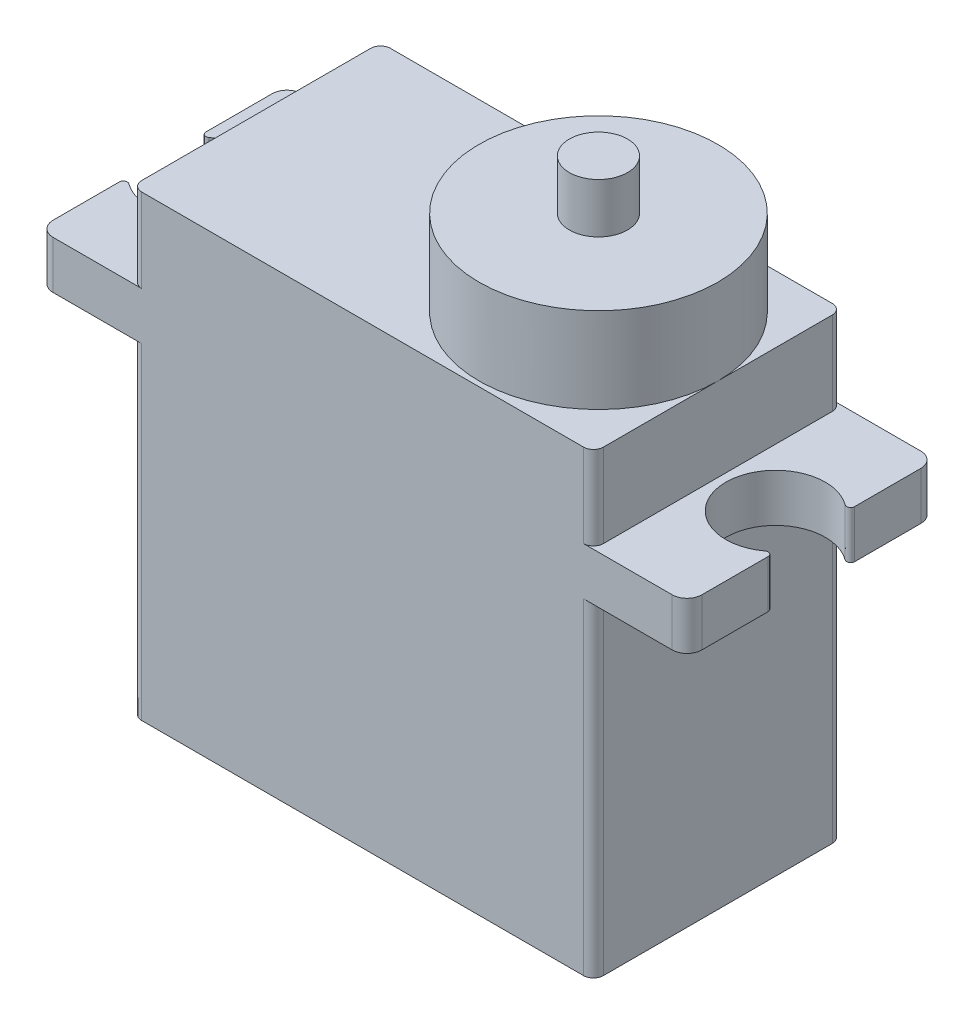
ISO-10303-21;
HEADER;
FILE_DESCRIPTION(('STEP AP214'),'2;1');
FILE_NAME('part.step','',(''),(''),'','','');
FILE_SCHEMA(('AUTOMOTIVE_DESIGN { 1 0 10303 214 1 1 1 1 }'));
ENDSEC;
DATA;
#1=APPLICATION_CONTEXT('core data for automotive mechanical design processes');
#2=APPLICATION_PROTOCOL_DEFINITION('international standard','automotive_design',2000,#1);
#3=PRODUCT_CONTEXT('',#1,'mechanical');
#4=PRODUCT('Part','Part','',(#3));
#5=PRODUCT_RELATED_PRODUCT_CATEGORY('part','',(#4));
#6=PRODUCT_DEFINITION_FORMATION('','',#4);
#7=PRODUCT_DEFINITION_CONTEXT('part definition',#1,'design');
#8=PRODUCT_DEFINITION('design','',#6,#7);
#9=PRODUCT_DEFINITION_SHAPE('','',#8);
#10=(LENGTH_UNIT() NAMED_UNIT(*) SI_UNIT(.MILLI.,.METRE.));
#11=(NAMED_UNIT(*) PLANE_ANGLE_UNIT() SI_UNIT($,.RADIAN.));
#12=(NAMED_UNIT(*) SI_UNIT($,.STERADIAN.) SOLID_ANGLE_UNIT());
#13=UNCERTAINTY_MEASURE_WITH_UNIT(LENGTH_MEASURE(1.E-05),#10,'distance_accuracy_value','');
#14=(GEOMETRIC_REPRESENTATION_CONTEXT(3) GLOBAL_UNCERTAINTY_ASSIGNED_CONTEXT((#13)) GLOBAL_UNIT_ASSIGNED_CONTEXT((#10,
#11,#12)) REPRESENTATION_CONTEXT('',''));
#15=CARTESIAN_POINT('',(0.,0.,0.));
#16=DIRECTION('',(0.,0.,1.));
#17=DIRECTION('',(1.,0.,0.));
#18=AXIS2_PLACEMENT_3D('',#15,#16,#17);
#19=CARTESIAN_POINT('',(16.3,16.4,-6.25));
#20=DIRECTION('',(1.,0.,0.));
#21=DIRECTION('',(0.,0.,-1.));
#22=AXIS2_PLACEMENT_3D('',#19,#20,#21);
#23=PLANE('',#22);
#24=DIRECTION('',(0.,0.,1.));
#25=VECTOR('',#24,1.);
#26=CARTESIAN_POINT('',(16.3,18.8,-6.25));
#27=LINE('',#26,#25);
#28=CARTESIAN_POINT('',(16.3,18.8,-5.5));
#29=VERTEX_POINT('',#28);
#30=CARTESIAN_POINT('',(16.3,18.8,-2.17485631709315));
#31=VERTEX_POINT('',#30);
#32=EDGE_CURVE('E494',#29,#31,#27,.T.);
#33=ORIENTED_EDGE('',*,*,#32,.T.);
#34=DIRECTION('',(0.,-1.,0.));
#35=VECTOR('',#34,1.);
#36=CARTESIAN_POINT('',(16.3,16.4,-2.17485631709315));
#37=LINE('',#36,#35);
#38=CARTESIAN_POINT('',(16.3,16.4,-2.17485631709315));
#39=VERTEX_POINT('',#38);
#40=EDGE_CURVE('E356',#31,#39,#37,.T.);
#41=ORIENTED_EDGE('',*,*,#40,.T.);
#42=DIRECTION('',(0.,0.,1.));
#43=VECTOR('',#42,1.);
#44=CARTESIAN_POINT('',(16.3,16.4,-6.25));
#45=LINE('',#44,#43);
#46=CARTESIAN_POINT('',(16.3,16.4,-5.5));
#47=VERTEX_POINT('',#46);
#48=EDGE_CURVE('E478',#47,#39,#45,.T.);
#49=ORIENTED_EDGE('',*,*,#48,.F.);
#50=DIRECTION('',(0.,1.,0.));
#51=VECTOR('',#50,1.);
#52=CARTESIAN_POINT('',(16.3,18.8,-5.5));
#53=LINE('',#52,#51);
#54=EDGE_CURVE('E298',#47,#29,#53,.T.);
#55=ORIENTED_EDGE('',*,*,#54,.T.);
#56=EDGE_LOOP('',(#33,#41,#49,#55));
#57=FACE_BOUND('',#56,.T.);
#58=ADVANCED_FACE('F37',(#57),#23,.T.);
#59=CARTESIAN_POINT('',(-16.3,16.4,-6.25));
#60=DIRECTION('',(-1.,0.,0.));
#61=DIRECTION('',(0.,0.,1.));
#62=AXIS2_PLACEMENT_3D('',#59,#60,#61);
#63=PLANE('',#62);
#64=DIRECTION('',(0.,0.,1.));
#65=VECTOR('',#64,1.);
#66=CARTESIAN_POINT('',(-16.3,18.8,-6.25));
#67=LINE('',#66,#65);
#68=CARTESIAN_POINT('',(-16.3,18.8,2.17485631709315));
#69=VERTEX_POINT('',#68);
#70=CARTESIAN_POINT('',(-16.3,18.8,5.5));
#71=VERTEX_POINT('',#70);
#72=EDGE_CURVE('E539',#69,#71,#67,.T.);
#73=ORIENTED_EDGE('',*,*,#72,.F.);
#74=DIRECTION('',(0.,-1.,0.));
#75=VECTOR('',#74,1.);
#76=CARTESIAN_POINT('',(-16.3,16.4,2.17485631709315));
#77=LINE('',#76,#75);
#78=CARTESIAN_POINT('',(-16.3,16.4,2.17485631709315));
#79=VERTEX_POINT('',#78);
#80=EDGE_CURVE('E368',#69,#79,#77,.T.);
#81=ORIENTED_EDGE('',*,*,#80,.T.);
#82=DIRECTION('',(0.,0.,1.));
#83=VECTOR('',#82,1.);
#84=CARTESIAN_POINT('',(-16.3,16.4,-6.25));
#85=LINE('',#84,#83);
#86=CARTESIAN_POINT('',(-16.3,16.4,5.5));
#87=VERTEX_POINT('',#86);
#88=EDGE_CURVE('E525',#79,#87,#85,.T.);
#89=ORIENTED_EDGE('',*,*,#88,.T.);
#90=DIRECTION('',(0.,-1.,0.));
#91=VECTOR('',#90,1.);
#92=CARTESIAN_POINT('',(-16.3,18.8,5.5));
#93=LINE('',#92,#91);
#94=EDGE_CURVE('E319',#87,#71,#93,.F.);
#95=ORIENTED_EDGE('',*,*,#94,.T.);
#96=EDGE_LOOP('',(#73,#81,#89,#95));
#97=FACE_BOUND('',#96,.T.);
#98=ADVANCED_FACE('F575',(#97),#63,.T.);
#99=CARTESIAN_POINT('',(-11.6,23.,6.25));
#100=DIRECTION('',(1.,0.,0.));
#101=DIRECTION('',(0.,0.,-1.));
#102=AXIS2_PLACEMENT_3D('',#99,#100,#101);
#103=PLANE('',#102);
#104=DIRECTION('',(0.,0.,1.));
#105=VECTOR('',#104,1.);
#106=CARTESIAN_POINT('',(-11.6,16.4,-6.25));
#107=LINE('',#106,#105);
#108=CARTESIAN_POINT('',(-11.6,16.4,-5.75));
#109=VERTEX_POINT('',#108);
#110=CARTESIAN_POINT('',(-11.6,16.4,5.75));
#111=VERTEX_POINT('',#110);
#112=EDGE_CURVE('E459',#109,#111,#107,.T.);
#113=ORIENTED_EDGE('',*,*,#112,.F.);
#114=DIRECTION('',(0.,-1.,0.));
#115=VECTOR('',#114,1.);
#116=CARTESIAN_POINT('',(-11.6,23.,-5.75));
#117=LINE('',#116,#115);
#118=CARTESIAN_POINT('',(-11.6,0.,-5.75));
#119=VERTEX_POINT('',#118);
#120=EDGE_CURVE('E378',#109,#119,#117,.T.);
#121=ORIENTED_EDGE('',*,*,#120,.T.);
#122=DIRECTION('',(0.,0.,1.));
#123=VECTOR('',#122,1.);
#124=CARTESIAN_POINT('',(-11.6,0.,6.25));
#125=LINE('',#124,#123);
#126=CARTESIAN_POINT('',(-11.6,0.,5.75));
#127=VERTEX_POINT('',#126);
#128=EDGE_CURVE('E273',#119,#127,#125,.T.);
#129=ORIENTED_EDGE('',*,*,#128,.T.);
#130=DIRECTION('',(0.,-1.,0.));
#131=VECTOR('',#130,1.);
#132=CARTESIAN_POINT('',(-11.6,23.,5.75));
#133=LINE('',#132,#131);
#134=EDGE_CURVE('E376',#127,#111,#133,.F.);
#135=ORIENTED_EDGE('',*,*,#134,.T.);
#136=EDGE_LOOP('',(#113,#121,#129,#135));
#137=FACE_BOUND('',#136,.T.);
#138=ADVANCED_FACE('F624',(#137),#103,.F.);
#139=CARTESIAN_POINT('',(11.6,23.,6.25));
#140=DIRECTION('',(-1.,0.,0.));
#141=DIRECTION('',(0.,0.,1.));
#142=AXIS2_PLACEMENT_3D('',#139,#140,#141);
#143=PLANE('',#142);
#144=DIRECTION('',(0.,0.,1.));
#145=VECTOR('',#144,1.);
#146=CARTESIAN_POINT('',(11.6,18.8,-6.25));
#147=LINE('',#146,#145);
#148=CARTESIAN_POINT('',(11.6,18.8,-5.75));
#149=VERTEX_POINT('',#148);
#150=CARTESIAN_POINT('',(11.6,18.8,5.75));
#151=VERTEX_POINT('',#150);
#152=EDGE_CURVE('E291',#149,#151,#147,.T.);
#153=ORIENTED_EDGE('',*,*,#152,.F.);
#154=DIRECTION('',(0.,-1.,0.));
#155=VECTOR('',#154,1.);
#156=CARTESIAN_POINT('',(11.6,23.,-5.75));
#157=LINE('',#156,#155);
#158=CARTESIAN_POINT('',(11.6,23.,-5.75));
#159=VERTEX_POINT('',#158);
#160=EDGE_CURVE('E269',#149,#159,#157,.F.);
#161=ORIENTED_EDGE('',*,*,#160,.T.);
#162=DIRECTION('',(0.,0.,-1.));
#163=VECTOR('',#162,1.);
#164=CARTESIAN_POINT('',(11.6,23.,6.25));
#165=LINE('',#164,#163);
#166=CARTESIAN_POINT('',(11.6,23.,0.));
#167=VERTEX_POINT('',#166);
#168=EDGE_CURVE('E263',#167,#159,#165,.T.);
#169=ORIENTED_EDGE('',*,*,#168,.F.);
#170=CARTESIAN_POINT('',(11.6,23.,5.75));
#171=VERTEX_POINT('',#170);
#172=EDGE_CURVE('E251',#171,#167,#165,.T.);
#173=ORIENTED_EDGE('',*,*,#172,.F.);
#174=DIRECTION('',(0.,-1.,0.));
#175=VECTOR('',#174,1.);
#176=CARTESIAN_POINT('',(11.6,23.,5.75));
#177=LINE('',#176,#175);
#178=EDGE_CURVE('E412',#171,#151,#177,.T.);
#179=ORIENTED_EDGE('',*,*,#178,.T.);
#180=EDGE_LOOP('',(#153,#161,#169,#173,#179));
#181=FACE_BOUND('',#180,.T.);
#182=ADVANCED_FACE('F267',(#181),#143,.F.);
#183=DIRECTION('',(0.,0.,-1.));
#184=VECTOR('',#183,1.);
#185=CARTESIAN_POINT('',(11.6,0.,6.25));
#186=LINE('',#185,#184);
#187=CARTESIAN_POINT('',(11.6,0.,5.75));
#188=VERTEX_POINT('',#187);
#189=CARTESIAN_POINT('',(11.6,0.,-5.75));
#190=VERTEX_POINT('',#189);
#191=EDGE_CURVE('E287',#188,#190,#186,.T.);
#192=ORIENTED_EDGE('',*,*,#191,.T.);
#193=DIRECTION('',(0.,-1.,0.));
#194=VECTOR('',#193,1.);
#195=CARTESIAN_POINT('',(11.6,23.,-5.75));
#196=LINE('',#195,#194);
#197=CARTESIAN_POINT('',(11.6,16.4,-5.75));
#198=VERTEX_POINT('',#197);
#199=EDGE_CURVE('E418',#190,#198,#196,.F.);
#200=ORIENTED_EDGE('',*,*,#199,.T.);
#201=DIRECTION('',(0.,0.,1.));
#202=VECTOR('',#201,1.);
#203=CARTESIAN_POINT('',(11.6,16.4,-6.25));
#204=LINE('',#203,#202);
#205=CARTESIAN_POINT('',(11.6,16.4,5.75));
#206=VERTEX_POINT('',#205);
#207=EDGE_CURVE('E277',#198,#206,#204,.T.);
#208=ORIENTED_EDGE('',*,*,#207,.T.);
#209=DIRECTION('',(0.,-1.,0.));
#210=VECTOR('',#209,1.);
#211=CARTESIAN_POINT('',(11.6,23.,5.75));
#212=LINE('',#211,#210);
#213=EDGE_CURVE('E415',#206,#188,#212,.T.);
#214=ORIENTED_EDGE('',*,*,#213,.T.);
#215=EDGE_LOOP('',(#192,#200,#208,#214));
#216=FACE_BOUND('',#215,.T.);
#217=ADVANCED_FACE('F473',(#216),#143,.F.);
#218=CARTESIAN_POINT('',(-11.6,23.,-6.25));
#219=DIRECTION('',(0.,0.,1.));
#220=DIRECTION('',(1.,0.,0.));
#221=AXIS2_PLACEMENT_3D('',#218,#219,#220);
#222=PLANE('',#221);
#223=DIRECTION('',(-1.,0.,0.));
#224=VECTOR('',#223,1.);
#225=CARTESIAN_POINT('',(-11.6,0.,-6.25));
#226=LINE('',#225,#224);
#227=CARTESIAN_POINT('',(11.1,0.,-6.25));
#228=VERTEX_POINT('',#227);
#229=CARTESIAN_POINT('',(-11.1,0.,-6.25));
#230=VERTEX_POINT('',#229);
#231=EDGE_CURVE('E290',#228,#230,#226,.T.);
#232=ORIENTED_EDGE('',*,*,#231,.T.);
#233=DIRECTION('',(0.,-1.,0.));
#234=VECTOR('',#233,1.);
#235=CARTESIAN_POINT('',(-11.1,23.,-6.25));
#236=LINE('',#235,#234);
#237=CARTESIAN_POINT('',(-11.1,16.4,-6.25));
#238=VERTEX_POINT('',#237);
#239=EDGE_CURVE('E397',#230,#238,#236,.F.);
#240=ORIENTED_EDGE('',*,*,#239,.T.);
#241=DIRECTION('',(1.,0.,0.));
#242=VECTOR('',#241,1.);
#243=CARTESIAN_POINT('',(-11.6,16.4,-6.25));
#244=LINE('',#243,#242);
#245=CARTESIAN_POINT('',(-15.55,16.4,-6.25));
#246=VERTEX_POINT('',#245);
#247=EDGE_CURVE('E535',#246,#238,#244,.T.);
#248=ORIENTED_EDGE('',*,*,#247,.F.);
#249=DIRECTION('',(0.,-1.,0.));
#250=VECTOR('',#249,1.);
#251=CARTESIAN_POINT('',(-15.55,18.8,-6.25));
#252=LINE('',#251,#250);
#253=CARTESIAN_POINT('',(-15.55,18.8,-6.25));
#254=VERTEX_POINT('',#253);
#255=EDGE_CURVE('E306',#246,#254,#252,.F.);
#256=ORIENTED_EDGE('',*,*,#255,.T.);
#257=DIRECTION('',(-1.,0.,0.));
#258=VECTOR('',#257,1.);
#259=CARTESIAN_POINT('',(-11.6,18.8,-6.25));
#260=LINE('',#259,#258);
#261=CARTESIAN_POINT('',(-11.1,18.8,-6.25));
#262=VERTEX_POINT('',#261);
#263=EDGE_CURVE('E544',#262,#254,#260,.T.);
#264=ORIENTED_EDGE('',*,*,#263,.F.);
#265=DIRECTION('',(0.,-1.,0.));
#266=VECTOR('',#265,1.);
#267=CARTESIAN_POINT('',(-11.1,23.,-6.25));
#268=LINE('',#267,#266);
#269=CARTESIAN_POINT('',(-11.1,23.,-6.25));
#270=VERTEX_POINT('',#269);
#271=EDGE_CURVE('E395',#262,#270,#268,.F.);
#272=ORIENTED_EDGE('',*,*,#271,.T.);
#273=DIRECTION('',(-1.,0.,0.));
#274=VECTOR('',#273,1.);
#275=CARTESIAN_POINT('',(-11.6,23.,-6.25));
#276=LINE('',#275,#274);
#277=CARTESIAN_POINT('',(11.1,23.,-6.25));
#278=VERTEX_POINT('',#277);
#279=EDGE_CURVE('E262',#278,#270,#276,.T.);
#280=ORIENTED_EDGE('',*,*,#279,.F.);
#281=DIRECTION('',(0.,-1.,0.));
#282=VECTOR('',#281,1.);
#283=CARTESIAN_POINT('',(11.1,23.,-6.25));
#284=LINE('',#283,#282);
#285=CARTESIAN_POINT('',(11.1,18.8,-6.25));
#286=VERTEX_POINT('',#285);
#287=EDGE_CURVE('E392',#278,#286,#284,.T.);
#288=ORIENTED_EDGE('',*,*,#287,.T.);
#289=DIRECTION('',(-1.,0.,0.));
#290=VECTOR('',#289,1.);
#291=CARTESIAN_POINT('',(11.6,18.8,-6.25));
#292=LINE('',#291,#290);
#293=CARTESIAN_POINT('',(15.55,18.8,-6.25));
#294=VERTEX_POINT('',#293);
#295=EDGE_CURVE('E477',#294,#286,#292,.T.);
#296=ORIENTED_EDGE('',*,*,#295,.F.);
#297=DIRECTION('',(0.,1.,0.));
#298=VECTOR('',#297,1.);
#299=CARTESIAN_POINT('',(15.55,16.4,-6.25));
#300=LINE('',#299,#298);
#301=CARTESIAN_POINT('',(15.55,16.4,-6.25));
#302=VERTEX_POINT('',#301);
#303=EDGE_CURVE('E308',#294,#302,#300,.F.);
#304=ORIENTED_EDGE('',*,*,#303,.T.);
#305=DIRECTION('',(1.,0.,0.));
#306=VECTOR('',#305,1.);
#307=CARTESIAN_POINT('',(11.6,16.4,-6.25));
#308=LINE('',#307,#306);
#309=CARTESIAN_POINT('',(11.1,16.4,-6.25));
#310=VERTEX_POINT('',#309);
#311=EDGE_CURVE('E479',#310,#302,#308,.T.);
#312=ORIENTED_EDGE('',*,*,#311,.F.);
#313=DIRECTION('',(0.,-1.,0.));
#314=VECTOR('',#313,1.);
#315=CARTESIAN_POINT('',(11.1,23.,-6.25));
#316=LINE('',#315,#314);
#317=EDGE_CURVE('E389',#310,#228,#316,.T.);
#318=ORIENTED_EDGE('',*,*,#317,.T.);
#319=EDGE_LOOP('',(#232,#240,#248,#256,#264,#272,#280,#288,#296,#304,#312,#318));
#320=FACE_BOUND('',#319,.T.);
#321=ADVANCED_FACE('F597',(#320),#222,.F.);
#322=DIRECTION('',(0.,0.,1.));
#323=VECTOR('',#322,1.);
#324=CARTESIAN_POINT('',(-11.6,23.,6.25));
#325=LINE('',#324,#323);
#326=CARTESIAN_POINT('',(-11.6,23.,-5.75));
#327=VERTEX_POINT('',#326);
#328=CARTESIAN_POINT('',(-11.6,23.,5.75));
#329=VERTEX_POINT('',#328);
#330=EDGE_CURVE('E281',#327,#329,#325,.T.);
#331=ORIENTED_EDGE('',*,*,#330,.F.);
#332=DIRECTION('',(0.,-1.,0.));
#333=VECTOR('',#332,1.);
#334=CARTESIAN_POINT('',(-11.6,23.,-5.75));
#335=LINE('',#334,#333);
#336=CARTESIAN_POINT('',(-11.6,18.8,-5.75));
#337=VERTEX_POINT('',#336);
#338=EDGE_CURVE('E402',#327,#337,#335,.T.);
#339=ORIENTED_EDGE('',*,*,#338,.T.);
#340=DIRECTION('',(0.,0.,1.));
#341=VECTOR('',#340,1.);
#342=CARTESIAN_POINT('',(-11.6,18.8,-6.25));
#343=LINE('',#342,#341);
#344=CARTESIAN_POINT('',(-11.6,18.8,5.75));
#345=VERTEX_POINT('',#344);
#346=EDGE_CURVE('E532',#337,#345,#343,.T.);
#347=ORIENTED_EDGE('',*,*,#346,.T.);
#348=DIRECTION('',(0.,-1.,0.));
#349=VECTOR('',#348,1.);
#350=CARTESIAN_POINT('',(-11.6,23.,5.75));
#351=LINE('',#350,#349);
#352=EDGE_CURVE('E400',#345,#329,#351,.F.);
#353=ORIENTED_EDGE('',*,*,#352,.T.);
#354=EDGE_LOOP('',(#331,#339,#347,#353));
#355=FACE_BOUND('',#354,.T.);
#356=ADVANCED_FACE('F591',(#355),#103,.F.);
#357=CARTESIAN_POINT('',(-11.6,23.,6.25));
#358=DIRECTION('',(0.,0.,-1.));
#359=DIRECTION('',(-1.,0.,0.));
#360=AXIS2_PLACEMENT_3D('',#357,#358,#359);
#361=PLANE('',#360);
#362=DIRECTION('',(-1.,0.,0.));
#363=VECTOR('',#362,1.);
#364=CARTESIAN_POINT('',(11.6,18.8,6.25));
#365=LINE('',#364,#363);
#366=CARTESIAN_POINT('',(15.55,18.8,6.25));
#367=VERTEX_POINT('',#366);
#368=CARTESIAN_POINT('',(11.1,18.8,6.25));
#369=VERTEX_POINT('',#368);
#370=EDGE_CURVE('E53',#367,#369,#365,.T.);
#371=ORIENTED_EDGE('',*,*,#370,.T.);
#372=DIRECTION('',(0.,-1.,0.));
#373=VECTOR('',#372,1.);
#374=CARTESIAN_POINT('',(11.1,23.,6.25));
#375=LINE('',#374,#373);
#376=CARTESIAN_POINT('',(11.1,23.,6.25));
#377=VERTEX_POINT('',#376);
#378=EDGE_CURVE('E429',#369,#377,#375,.F.);
#379=ORIENTED_EDGE('',*,*,#378,.T.);
#380=DIRECTION('',(1.,0.,0.));
#381=VECTOR('',#380,1.);
#382=CARTESIAN_POINT('',(-11.6,23.,6.25));
#383=LINE('',#382,#381);
#384=CARTESIAN_POINT('',(-11.1,23.,6.25));
#385=VERTEX_POINT('',#384);
#386=EDGE_CURVE('E284',#385,#377,#383,.T.);
#387=ORIENTED_EDGE('',*,*,#386,.F.);
#388=DIRECTION('',(0.,-1.,0.));
#389=VECTOR('',#388,1.);
#390=CARTESIAN_POINT('',(-11.1,23.,6.25));
#391=LINE('',#390,#389);
#392=CARTESIAN_POINT('',(-11.1,18.8,6.25));
#393=VERTEX_POINT('',#392);
#394=EDGE_CURVE('E426',#385,#393,#391,.T.);
#395=ORIENTED_EDGE('',*,*,#394,.T.);
#396=DIRECTION('',(-1.,0.,0.));
#397=VECTOR('',#396,1.);
#398=CARTESIAN_POINT('',(-11.6,18.8,6.25));
#399=LINE('',#398,#397);
#400=CARTESIAN_POINT('',(-15.55,18.8,6.25));
#401=VERTEX_POINT('',#400);
#402=EDGE_CURVE('E61',#393,#401,#399,.T.);
#403=ORIENTED_EDGE('',*,*,#402,.T.);
#404=DIRECTION('',(0.,-1.,0.));
#405=VECTOR('',#404,1.);
#406=CARTESIAN_POINT('',(-15.55,16.4,6.25));
#407=LINE('',#406,#405);
#408=CARTESIAN_POINT('',(-15.55,16.4,6.25));
#409=VERTEX_POINT('',#408);
#410=EDGE_CURVE('E314',#401,#409,#407,.T.);
#411=ORIENTED_EDGE('',*,*,#410,.T.);
#412=DIRECTION('',(1.,0.,0.));
#413=VECTOR('',#412,1.);
#414=CARTESIAN_POINT('',(-11.6,16.4,6.25));
#415=LINE('',#414,#413);
#416=CARTESIAN_POINT('',(-11.1,16.4,6.25));
#417=VERTEX_POINT('',#416);
#418=EDGE_CURVE('E457',#409,#417,#415,.T.);
#419=ORIENTED_EDGE('',*,*,#418,.T.);
#420=DIRECTION('',(0.,-1.,0.));
#421=VECTOR('',#420,1.);
#422=CARTESIAN_POINT('',(-11.1,23.,6.25));
#423=LINE('',#422,#421);
#424=CARTESIAN_POINT('',(-11.1,0.,6.25));
#425=VERTEX_POINT('',#424);
#426=EDGE_CURVE('E420',#417,#425,#423,.T.);
#427=ORIENTED_EDGE('',*,*,#426,.T.);
#428=DIRECTION('',(1.,0.,0.));
#429=VECTOR('',#428,1.);
#430=CARTESIAN_POINT('',(-11.6,0.,6.25));
#431=LINE('',#430,#429);
#432=CARTESIAN_POINT('',(11.1,0.,6.25));
#433=VERTEX_POINT('',#432);
#434=EDGE_CURVE('E271',#425,#433,#431,.T.);
#435=ORIENTED_EDGE('',*,*,#434,.T.);
#436=DIRECTION('',(0.,-1.,0.));
#437=VECTOR('',#436,1.);
#438=CARTESIAN_POINT('',(11.1,23.,6.25));
#439=LINE('',#438,#437);
#440=CARTESIAN_POINT('',(11.1,16.4,6.25));
#441=VERTEX_POINT('',#440);
#442=EDGE_CURVE('E423',#433,#441,#439,.F.);
#443=ORIENTED_EDGE('',*,*,#442,.T.);
#444=DIRECTION('',(1.,0.,0.));
#445=VECTOR('',#444,1.);
#446=CARTESIAN_POINT('',(11.6,16.4,6.25));
#447=LINE('',#446,#445);
#448=CARTESIAN_POINT('',(15.55,16.4,6.25));
#449=VERTEX_POINT('',#448);
#450=EDGE_CURVE('E488',#441,#449,#447,.T.);
#451=ORIENTED_EDGE('',*,*,#450,.T.);
#452=DIRECTION('',(0.,1.,0.));
#453=VECTOR('',#452,1.);
#454=CARTESIAN_POINT('',(15.55,18.8,6.25));
#455=LINE('',#454,#453);
#456=EDGE_CURVE('E317',#449,#367,#455,.T.);
#457=ORIENTED_EDGE('',*,*,#456,.T.);
#458=EDGE_LOOP('',(#371,#379,#387,#395,#403,#411,#419,#427,#435,#443,#451,#457));
#459=FACE_BOUND('',#458,.T.);
#460=ADVANCED_FACE('F463',(#459),#361,.F.);
#461=CARTESIAN_POINT('',(0.,23.,0.));
#462=DIRECTION('',(0.,-1.,0.));
#463=DIRECTION('',(0.,0.,-1.));
#464=AXIS2_PLACEMENT_3D('',#461,#462,#463);
#465=PLANE('',#464);
#466=ORIENTED_EDGE('',*,*,#172,.T.);
#467=CARTESIAN_POINT('',(5.6,23.,0.));
#468=DIRECTION('',(0.,1.,0.));
#469=DIRECTION('',(0.,0.,1.));
#470=AXIS2_PLACEMENT_3D('',#467,#468,#469);
#471=CIRCLE('',#470,6.);
#472=EDGE_CURVE('E255',#167,#167,#471,.T.);
#473=ORIENTED_EDGE('',*,*,#472,.F.);
#474=ORIENTED_EDGE('',*,*,#168,.T.);
#475=CARTESIAN_POINT('',(11.1,23.,-5.75));
#476=DIRECTION('',(0.,-1.,0.));
#477=DIRECTION('',(0.,0.,-1.));
#478=AXIS2_PLACEMENT_3D('',#475,#476,#477);
#479=CIRCLE('',#478,0.5);
#480=EDGE_CURVE('E408',#159,#278,#479,.F.);
#481=ORIENTED_EDGE('',*,*,#480,.T.);
#482=ORIENTED_EDGE('',*,*,#279,.T.);
#483=CARTESIAN_POINT('',(-11.1,23.,-5.75));
#484=DIRECTION('',(0.,-1.,0.));
#485=DIRECTION('',(0.,0.,-1.));
#486=AXIS2_PLACEMENT_3D('',#483,#484,#485);
#487=CIRCLE('',#486,0.5);
#488=EDGE_CURVE('E410',#270,#327,#487,.F.);
#489=ORIENTED_EDGE('',*,*,#488,.T.);
#490=ORIENTED_EDGE('',*,*,#330,.T.);
#491=CARTESIAN_POINT('',(-11.1,23.,5.75));
#492=DIRECTION('',(0.,-1.,0.));
#493=DIRECTION('',(0.,0.,-1.));
#494=AXIS2_PLACEMENT_3D('',#491,#492,#493);
#495=CIRCLE('',#494,0.5);
#496=EDGE_CURVE('E405',#329,#385,#495,.F.);
#497=ORIENTED_EDGE('',*,*,#496,.T.);
#498=ORIENTED_EDGE('',*,*,#386,.T.);
#499=CARTESIAN_POINT('',(11.1,23.,5.75));
#500=DIRECTION('',(0.,-1.,0.));
#501=DIRECTION('',(0.,0.,-1.));
#502=AXIS2_PLACEMENT_3D('',#499,#500,#501);
#503=CIRCLE('',#502,0.5);
#504=EDGE_CURVE('E258',#377,#171,#503,.F.);
#505=ORIENTED_EDGE('',*,*,#504,.T.);
#506=EDGE_LOOP('',(#466,#473,#474,#481,#482,#489,#490,#497,#498,#505));
#507=FACE_BOUND('',#506,.T.);
#508=ADVANCED_FACE('F253',(#507),#465,.F.);
#509=CARTESIAN_POINT('',(0.,0.,0.));
#510=DIRECTION('',(0.,-1.,0.));
#511=DIRECTION('',(0.,0.,-1.));
#512=AXIS2_PLACEMENT_3D('',#509,#510,#511);
#513=PLANE('',#512);
#514=ORIENTED_EDGE('',*,*,#128,.F.);
#515=CARTESIAN_POINT('',(-11.1,0.,-5.75));
#516=DIRECTION('',(0.,-1.,0.));
#517=DIRECTION('',(0.,0.,-1.));
#518=AXIS2_PLACEMENT_3D('',#515,#516,#517);
#519=CIRCLE('',#518,0.5);
#520=EDGE_CURVE('E387',#119,#230,#519,.T.);
#521=ORIENTED_EDGE('',*,*,#520,.T.);
#522=ORIENTED_EDGE('',*,*,#231,.F.);
#523=CARTESIAN_POINT('',(11.1,0.,-5.75));
#524=DIRECTION('',(0.,-1.,0.));
#525=DIRECTION('',(0.,0.,-1.));
#526=AXIS2_PLACEMENT_3D('',#523,#524,#525);
#527=CIRCLE('',#526,0.5);
#528=EDGE_CURVE('E385',#228,#190,#527,.T.);
#529=ORIENTED_EDGE('',*,*,#528,.T.);
#530=ORIENTED_EDGE('',*,*,#191,.F.);
#531=CARTESIAN_POINT('',(11.1,0.,5.75));
#532=DIRECTION('',(0.,-1.,0.));
#533=DIRECTION('',(0.,0.,-1.));
#534=AXIS2_PLACEMENT_3D('',#531,#532,#533);
#535=CIRCLE('',#534,0.5);
#536=EDGE_CURVE('E383',#188,#433,#535,.T.);
#537=ORIENTED_EDGE('',*,*,#536,.T.);
#538=ORIENTED_EDGE('',*,*,#434,.F.);
#539=CARTESIAN_POINT('',(-11.1,0.,5.75));
#540=DIRECTION('',(0.,-1.,0.));
#541=DIRECTION('',(0.,0.,-1.));
#542=AXIS2_PLACEMENT_3D('',#539,#540,#541);
#543=CIRCLE('',#542,0.5);
#544=EDGE_CURVE('E381',#425,#127,#543,.T.);
#545=ORIENTED_EDGE('',*,*,#544,.T.);
#546=EDGE_LOOP('',(#514,#521,#522,#529,#530,#537,#538,#545));
#547=FACE_BOUND('',#546,.T.);
#548=ADVANCED_FACE('F467',(#547),#513,.T.);
#549=CARTESIAN_POINT('',(11.6,18.8,-6.25));
#550=DIRECTION('',(0.,1.,0.));
#551=DIRECTION('',(0.,0.,1.));
#552=AXIS2_PLACEMENT_3D('',#549,#550,#551);
#553=PLANE('',#552);
#554=CARTESIAN_POINT('',(16.3,18.8,2.17485631709315));
#555=VERTEX_POINT('',#554);
#556=CARTESIAN_POINT('',(16.3,18.8,5.5));
#557=VERTEX_POINT('',#556);
#558=EDGE_CURVE('E496',#555,#557,#27,.T.);
#559=ORIENTED_EDGE('',*,*,#558,.F.);
#560=CARTESIAN_POINT('',(16.1,18.8,2.17485631709315));
#561=DIRECTION('',(0.,1.,0.));
#562=DIRECTION('',(0.,0.,1.));
#563=AXIS2_PLACEMENT_3D('',#560,#561,#562);
#564=CIRCLE('',#563,0.2);
#565=CARTESIAN_POINT('',(15.9814814814815,18.8,2.01375584916033));
#566=VERTEX_POINT('',#565);
#567=EDGE_CURVE('E354',#555,#566,#564,.T.);
#568=ORIENTED_EDGE('',*,*,#567,.T.);
#569=CARTESIAN_POINT('',(14.5,18.8,0.));
#570=DIRECTION('',(0.,1.,0.));
#571=DIRECTION('',(0.,0.,1.));
#572=AXIS2_PLACEMENT_3D('',#569,#570,#571);
#573=CIRCLE('',#572,2.5);
#574=CARTESIAN_POINT('',(15.9814814814815,18.8,-2.01375584916033));
#575=VERTEX_POINT('',#574);
#576=EDGE_CURVE('E519',#575,#566,#573,.T.);
#577=ORIENTED_EDGE('',*,*,#576,.F.);
#578=CARTESIAN_POINT('',(16.1,18.8,-2.17485631709315));
#579=DIRECTION('',(0.,1.,0.));
#580=DIRECTION('',(0.,0.,1.));
#581=AXIS2_PLACEMENT_3D('',#578,#579,#580);
#582=CIRCLE('',#581,0.2);
#583=EDGE_CURVE('E352',#575,#31,#582,.T.);
#584=ORIENTED_EDGE('',*,*,#583,.T.);
#585=ORIENTED_EDGE('',*,*,#32,.F.);
#586=CARTESIAN_POINT('',(15.55,18.8,-5.5));
#587=DIRECTION('',(0.,1.,0.));
#588=DIRECTION('',(0.,0.,1.));
#589=AXIS2_PLACEMENT_3D('',#586,#587,#588);
#590=CIRCLE('',#589,0.75);
#591=EDGE_CURVE('E304',#29,#294,#590,.T.);
#592=ORIENTED_EDGE('',*,*,#591,.T.);
#593=ORIENTED_EDGE('',*,*,#295,.T.);
#594=CARTESIAN_POINT('',(11.1,18.8,-5.75));
#595=DIRECTION('',(0.,1.,0.));
#596=DIRECTION('',(0.,0.,1.));
#597=AXIS2_PLACEMENT_3D('',#594,#595,#596);
#598=CIRCLE('',#597,0.5);
#599=EDGE_CURVE('E436',#286,#149,#598,.F.);
#600=ORIENTED_EDGE('',*,*,#599,.T.);
#601=ORIENTED_EDGE('',*,*,#152,.T.);
#602=CARTESIAN_POINT('',(11.1,18.8,5.75));
#603=DIRECTION('',(0.,1.,0.));
#604=DIRECTION('',(0.,0.,1.));
#605=AXIS2_PLACEMENT_3D('',#602,#603,#604);
#606=CIRCLE('',#605,0.5);
#607=EDGE_CURVE('E441',#151,#369,#606,.F.);
#608=ORIENTED_EDGE('',*,*,#607,.T.);
#609=ORIENTED_EDGE('',*,*,#370,.F.);
#610=CARTESIAN_POINT('',(15.55,18.8,5.5));
#611=DIRECTION('',(0.,1.,0.));
#612=DIRECTION('',(0.,0.,1.));
#613=AXIS2_PLACEMENT_3D('',#610,#611,#612);
#614=CIRCLE('',#613,0.75);
#615=EDGE_CURVE('E301',#367,#557,#614,.T.);
#616=ORIENTED_EDGE('',*,*,#615,.T.);
#617=EDGE_LOOP('',(#559,#568,#577,#584,#585,#592,#593,#600,#601,#608,#609,#616));
#618=FACE_BOUND('',#617,.T.);
#619=ADVANCED_FACE('F508',(#618),#553,.T.);
#620=CARTESIAN_POINT('',(16.3,16.4,2.17485631709315));
#621=VERTEX_POINT('',#620);
#622=CARTESIAN_POINT('',(16.3,16.4,5.5));
#623=VERTEX_POINT('',#622);
#624=EDGE_CURVE('E476',#621,#623,#45,.T.);
#625=ORIENTED_EDGE('',*,*,#624,.F.);
#626=DIRECTION('',(0.,-1.,0.));
#627=VECTOR('',#626,1.);
#628=CARTESIAN_POINT('',(16.3,18.8,2.17485631709315));
#629=LINE('',#628,#627);
#630=EDGE_CURVE('E350',#621,#555,#629,.F.);
#631=ORIENTED_EDGE('',*,*,#630,.T.);
#632=ORIENTED_EDGE('',*,*,#558,.T.);
#633=DIRECTION('',(0.,1.,0.));
#634=VECTOR('',#633,1.);
#635=CARTESIAN_POINT('',(16.3,16.4,5.5));
#636=LINE('',#635,#634);
#637=EDGE_CURVE('E286',#557,#623,#636,.F.);
#638=ORIENTED_EDGE('',*,*,#637,.T.);
#639=EDGE_LOOP('',(#625,#631,#632,#638));
#640=FACE_BOUND('',#639,.T.);
#641=ADVANCED_FACE('F503',(#640),#23,.T.);
#642=CARTESIAN_POINT('',(11.6,16.4,-6.25));
#643=DIRECTION('',(0.,-1.,0.));
#644=DIRECTION('',(0.,0.,-1.));
#645=AXIS2_PLACEMENT_3D('',#642,#643,#644);
#646=PLANE('',#645);
#647=CARTESIAN_POINT('',(14.5,16.4,0.));
#648=DIRECTION('',(0.,-1.,0.));
#649=DIRECTION('',(0.,0.,-1.));
#650=AXIS2_PLACEMENT_3D('',#647,#648,#649);
#651=CIRCLE('',#650,2.5);
#652=CARTESIAN_POINT('',(15.9814814814815,16.4,2.01375584916033));
#653=VERTEX_POINT('',#652);
#654=CARTESIAN_POINT('',(15.9814814814815,16.4,-2.01375584916033));
#655=VERTEX_POINT('',#654);
#656=EDGE_CURVE('E337',#653,#655,#651,.T.);
#657=ORIENTED_EDGE('',*,*,#656,.F.);
#658=CARTESIAN_POINT('',(16.1,16.4,2.17485631709315));
#659=DIRECTION('',(0.,-1.,0.));
#660=DIRECTION('',(0.,0.,-1.));
#661=AXIS2_PLACEMENT_3D('',#658,#659,#660);
#662=CIRCLE('',#661,0.2);
#663=EDGE_CURVE('E348',#653,#621,#662,.T.);
#664=ORIENTED_EDGE('',*,*,#663,.T.);
#665=ORIENTED_EDGE('',*,*,#624,.T.);
#666=CARTESIAN_POINT('',(15.55,16.4,5.5));
#667=DIRECTION('',(0.,-1.,0.));
#668=DIRECTION('',(0.,0.,-1.));
#669=AXIS2_PLACEMENT_3D('',#666,#667,#668);
#670=CIRCLE('',#669,0.75);
#671=EDGE_CURVE('E310',#623,#449,#670,.T.);
#672=ORIENTED_EDGE('',*,*,#671,.T.);
#673=ORIENTED_EDGE('',*,*,#450,.F.);
#674=CARTESIAN_POINT('',(11.1,16.4,5.75));
#675=DIRECTION('',(0.,-1.,0.));
#676=DIRECTION('',(0.,0.,-1.));
#677=AXIS2_PLACEMENT_3D('',#674,#675,#676);
#678=CIRCLE('',#677,0.5);
#679=EDGE_CURVE('E444',#441,#206,#678,.F.);
#680=ORIENTED_EDGE('',*,*,#679,.T.);
#681=ORIENTED_EDGE('',*,*,#207,.F.);
#682=CARTESIAN_POINT('',(11.1,16.4,-5.75));
#683=DIRECTION('',(0.,-1.,0.));
#684=DIRECTION('',(0.,0.,-1.));
#685=AXIS2_PLACEMENT_3D('',#682,#683,#684);
#686=CIRCLE('',#685,0.5);
#687=EDGE_CURVE('E438',#198,#310,#686,.F.);
#688=ORIENTED_EDGE('',*,*,#687,.T.);
#689=ORIENTED_EDGE('',*,*,#311,.T.);
#690=CARTESIAN_POINT('',(15.55,16.4,-5.5));
#691=DIRECTION('',(0.,-1.,0.));
#692=DIRECTION('',(0.,0.,-1.));
#693=AXIS2_PLACEMENT_3D('',#690,#691,#692);
#694=CIRCLE('',#693,0.75);
#695=EDGE_CURVE('E312',#302,#47,#694,.T.);
#696=ORIENTED_EDGE('',*,*,#695,.T.);
#697=ORIENTED_EDGE('',*,*,#48,.T.);
#698=CARTESIAN_POINT('',(16.1,16.4,-2.17485631709315));
#699=DIRECTION('',(0.,-1.,0.));
#700=DIRECTION('',(0.,0.,-1.));
#701=AXIS2_PLACEMENT_3D('',#698,#699,#700);
#702=CIRCLE('',#701,0.2);
#703=EDGE_CURVE('E346',#39,#655,#702,.T.);
#704=ORIENTED_EDGE('',*,*,#703,.T.);
#705=EDGE_LOOP('',(#657,#664,#665,#672,#673,#680,#681,#688,#689,#696,#697,#704));
#706=FACE_BOUND('',#705,.T.);
#707=ADVANCED_FACE('F513',(#706),#646,.T.);
#708=CARTESIAN_POINT('',(-11.6,16.4,-6.25));
#709=DIRECTION('',(0.,-1.,0.));
#710=DIRECTION('',(0.,0.,-1.));
#711=AXIS2_PLACEMENT_3D('',#708,#709,#710);
#712=PLANE('',#711);
#713=ORIENTED_EDGE('',*,*,#88,.F.);
#714=CARTESIAN_POINT('',(-16.1,16.4,2.17485631709315));
#715=DIRECTION('',(0.,-1.,0.));
#716=DIRECTION('',(0.,0.,-1.));
#717=AXIS2_PLACEMENT_3D('',#714,#715,#716);
#718=CIRCLE('',#717,0.2);
#719=CARTESIAN_POINT('',(-15.9814814814815,16.4,2.01375584916033));
#720=VERTEX_POINT('',#719);
#721=EDGE_CURVE('E372',#79,#720,#718,.T.);
#722=ORIENTED_EDGE('',*,*,#721,.T.);
#723=CARTESIAN_POINT('',(-14.5,16.4,0.));
#724=DIRECTION('',(0.,-1.,0.));
#725=DIRECTION('',(0.,0.,-1.));
#726=AXIS2_PLACEMENT_3D('',#723,#724,#725);
#727=CIRCLE('',#726,2.5);
#728=CARTESIAN_POINT('',(-15.9814814814815,16.4,-2.01375584916032));
#729=VERTEX_POINT('',#728);
#730=EDGE_CURVE('E523',#729,#720,#727,.T.);
#731=ORIENTED_EDGE('',*,*,#730,.F.);
#732=CARTESIAN_POINT('',(-16.1,16.4,-2.17485631709315));
#733=DIRECTION('',(0.,-1.,0.));
#734=DIRECTION('',(0.,0.,-1.));
#735=AXIS2_PLACEMENT_3D('',#732,#733,#734);
#736=CIRCLE('',#735,0.2);
#737=CARTESIAN_POINT('',(-16.3,16.4,-2.17485631709315));
#738=VERTEX_POINT('',#737);
#739=EDGE_CURVE('E370',#729,#738,#736,.T.);
#740=ORIENTED_EDGE('',*,*,#739,.T.);
#741=CARTESIAN_POINT('',(-16.3,16.4,-5.5));
#742=VERTEX_POINT('',#741);
#743=EDGE_CURVE('E540',#742,#738,#85,.T.);
#744=ORIENTED_EDGE('',*,*,#743,.F.);
#745=CARTESIAN_POINT('',(-15.55,16.4,-5.5));
#746=DIRECTION('',(0.,-1.,0.));
#747=DIRECTION('',(0.,0.,-1.));
#748=AXIS2_PLACEMENT_3D('',#745,#746,#747);
#749=CIRCLE('',#748,0.75);
#750=EDGE_CURVE('E328',#742,#246,#749,.T.);
#751=ORIENTED_EDGE('',*,*,#750,.T.);
#752=ORIENTED_EDGE('',*,*,#247,.T.);
#753=CARTESIAN_POINT('',(-11.1,16.4,-5.75));
#754=DIRECTION('',(0.,-1.,0.));
#755=DIRECTION('',(0.,0.,-1.));
#756=AXIS2_PLACEMENT_3D('',#753,#754,#755);
#757=CIRCLE('',#756,0.5);
#758=EDGE_CURVE('E431',#238,#109,#757,.F.);
#759=ORIENTED_EDGE('',*,*,#758,.T.);
#760=ORIENTED_EDGE('',*,*,#112,.T.);
#761=CARTESIAN_POINT('',(-11.1,16.4,5.75));
#762=DIRECTION('',(0.,-1.,0.));
#763=DIRECTION('',(0.,0.,-1.));
#764=AXIS2_PLACEMENT_3D('',#761,#762,#763);
#765=CIRCLE('',#764,0.5);
#766=EDGE_CURVE('E41',#111,#417,#765,.F.);
#767=ORIENTED_EDGE('',*,*,#766,.T.);
#768=ORIENTED_EDGE('',*,*,#418,.F.);
#769=CARTESIAN_POINT('',(-15.55,16.4,5.5));
#770=DIRECTION('',(0.,-1.,0.));
#771=DIRECTION('',(0.,0.,-1.));
#772=AXIS2_PLACEMENT_3D('',#769,#770,#771);
#773=CIRCLE('',#772,0.75);
#774=EDGE_CURVE('E325',#409,#87,#773,.T.);
#775=ORIENTED_EDGE('',*,*,#774,.T.);
#776=EDGE_LOOP('',(#713,#722,#731,#740,#744,#751,#752,#759,#760,#767,#768,#775));
#777=FACE_BOUND('',#776,.T.);
#778=ADVANCED_FACE('F456',(#777),#712,.T.);
#779=ORIENTED_EDGE('',*,*,#743,.T.);
#780=DIRECTION('',(0.,-1.,0.));
#781=VECTOR('',#780,1.);
#782=CARTESIAN_POINT('',(-16.3,18.8,-2.17485631709315));
#783=LINE('',#782,#781);
#784=CARTESIAN_POINT('',(-16.3,18.8,-2.17485631709315));
#785=VERTEX_POINT('',#784);
#786=EDGE_CURVE('E374',#738,#785,#783,.F.);
#787=ORIENTED_EDGE('',*,*,#786,.T.);
#788=CARTESIAN_POINT('',(-16.3,18.8,-5.5));
#789=VERTEX_POINT('',#788);
#790=EDGE_CURVE('E536',#789,#785,#67,.T.);
#791=ORIENTED_EDGE('',*,*,#790,.F.);
#792=DIRECTION('',(0.,-1.,0.));
#793=VECTOR('',#792,1.);
#794=CARTESIAN_POINT('',(-16.3,16.4,-5.5));
#795=LINE('',#794,#793);
#796=EDGE_CURVE('E322',#789,#742,#795,.T.);
#797=ORIENTED_EDGE('',*,*,#796,.T.);
#798=EDGE_LOOP('',(#779,#787,#791,#797));
#799=FACE_BOUND('',#798,.T.);
#800=ADVANCED_FACE('F560',(#799),#63,.T.);
#801=CARTESIAN_POINT('',(-11.6,18.8,-6.25));
#802=DIRECTION('',(0.,1.,0.));
#803=DIRECTION('',(0.,0.,1.));
#804=AXIS2_PLACEMENT_3D('',#801,#802,#803);
#805=PLANE('',#804);
#806=CARTESIAN_POINT('',(-14.5,18.8,0.));
#807=DIRECTION('',(0.,1.,0.));
#808=DIRECTION('',(0.,0.,1.));
#809=AXIS2_PLACEMENT_3D('',#806,#807,#808);
#810=CIRCLE('',#809,2.5);
#811=CARTESIAN_POINT('',(-15.9814814814815,18.8,2.01375584916033));
#812=VERTEX_POINT('',#811);
#813=CARTESIAN_POINT('',(-15.9814814814815,18.8,-2.01375584916032));
#814=VERTEX_POINT('',#813);
#815=EDGE_CURVE('E334',#812,#814,#810,.T.);
#816=ORIENTED_EDGE('',*,*,#815,.F.);
#817=CARTESIAN_POINT('',(-16.1,18.8,2.17485631709315));
#818=DIRECTION('',(0.,1.,0.));
#819=DIRECTION('',(0.,0.,1.));
#820=AXIS2_PLACEMENT_3D('',#817,#818,#819);
#821=CIRCLE('',#820,0.2);
#822=EDGE_CURVE('E366',#812,#69,#821,.T.);
#823=ORIENTED_EDGE('',*,*,#822,.T.);
#824=ORIENTED_EDGE('',*,*,#72,.T.);
#825=CARTESIAN_POINT('',(-15.55,18.8,5.5));
#826=DIRECTION('',(0.,1.,0.));
#827=DIRECTION('',(0.,0.,1.));
#828=AXIS2_PLACEMENT_3D('',#825,#826,#827);
#829=CIRCLE('',#828,0.75);
#830=EDGE_CURVE('E330',#71,#401,#829,.T.);
#831=ORIENTED_EDGE('',*,*,#830,.T.);
#832=ORIENTED_EDGE('',*,*,#402,.F.);
#833=CARTESIAN_POINT('',(-11.1,18.8,5.75));
#834=DIRECTION('',(0.,1.,0.));
#835=DIRECTION('',(0.,0.,1.));
#836=AXIS2_PLACEMENT_3D('',#833,#834,#835);
#837=CIRCLE('',#836,0.5);
#838=EDGE_CURVE('E443',#393,#345,#837,.F.);
#839=ORIENTED_EDGE('',*,*,#838,.T.);
#840=ORIENTED_EDGE('',*,*,#346,.F.);
#841=CARTESIAN_POINT('',(-11.1,18.8,-5.75));
#842=DIRECTION('',(0.,1.,0.));
#843=DIRECTION('',(0.,0.,1.));
#844=AXIS2_PLACEMENT_3D('',#841,#842,#843);
#845=CIRCLE('',#844,0.5);
#846=EDGE_CURVE('E433',#337,#262,#845,.F.);
#847=ORIENTED_EDGE('',*,*,#846,.T.);
#848=ORIENTED_EDGE('',*,*,#263,.T.);
#849=CARTESIAN_POINT('',(-15.55,18.8,-5.5));
#850=DIRECTION('',(0.,1.,0.));
#851=DIRECTION('',(0.,0.,1.));
#852=AXIS2_PLACEMENT_3D('',#849,#850,#851);
#853=CIRCLE('',#852,0.75);
#854=EDGE_CURVE('E332',#254,#789,#853,.T.);
#855=ORIENTED_EDGE('',*,*,#854,.T.);
#856=ORIENTED_EDGE('',*,*,#790,.T.);
#857=CARTESIAN_POINT('',(-16.1,18.8,-2.17485631709315));
#858=DIRECTION('',(0.,1.,0.));
#859=DIRECTION('',(0.,0.,1.));
#860=AXIS2_PLACEMENT_3D('',#857,#858,#859);
#861=CIRCLE('',#860,0.2);
#862=EDGE_CURVE('E364',#785,#814,#861,.T.);
#863=ORIENTED_EDGE('',*,*,#862,.T.);
#864=EDGE_LOOP('',(#816,#823,#824,#831,#832,#839,#840,#847,#848,#855,#856,#863));
#865=FACE_BOUND('',#864,.T.);
#866=ADVANCED_FACE('F549',(#865),#805,.T.);
#867=CARTESIAN_POINT('',(15.55,16.4,-5.5));
#868=DIRECTION('',(0.,-1.,0.));
#869=DIRECTION('',(0.,0.,-1.));
#870=AXIS2_PLACEMENT_3D('',#867,#868,#869);
#871=CYLINDRICAL_SURFACE('',#870,0.75);
#872=ORIENTED_EDGE('',*,*,#695,.F.);
#873=ORIENTED_EDGE('',*,*,#303,.F.);
#874=ORIENTED_EDGE('',*,*,#591,.F.);
#875=ORIENTED_EDGE('',*,*,#54,.F.);
#876=EDGE_LOOP('',(#872,#873,#874,#875));
#877=FACE_BOUND('',#876,.T.);
#878=ADVANCED_FACE('F604',(#877),#871,.T.);
#879=CARTESIAN_POINT('',(15.55,23.,5.5));
#880=DIRECTION('',(0.,-1.,0.));
#881=DIRECTION('',(0.,0.,-1.));
#882=AXIS2_PLACEMENT_3D('',#879,#880,#881);
#883=CYLINDRICAL_SURFACE('',#882,0.75);
#884=ORIENTED_EDGE('',*,*,#671,.F.);
#885=ORIENTED_EDGE('',*,*,#637,.F.);
#886=ORIENTED_EDGE('',*,*,#615,.F.);
#887=ORIENTED_EDGE('',*,*,#456,.F.);
#888=EDGE_LOOP('',(#884,#885,#886,#887));
#889=FACE_BOUND('',#888,.T.);
#890=ADVANCED_FACE('F511',(#889),#883,.T.);
#891=CARTESIAN_POINT('',(-15.55,16.4,-5.5));
#892=DIRECTION('',(0.,1.,0.));
#893=DIRECTION('',(0.,0.,1.));
#894=AXIS2_PLACEMENT_3D('',#891,#892,#893);
#895=CYLINDRICAL_SURFACE('',#894,0.75);
#896=ORIENTED_EDGE('',*,*,#854,.F.);
#897=ORIENTED_EDGE('',*,*,#255,.F.);
#898=ORIENTED_EDGE('',*,*,#750,.F.);
#899=ORIENTED_EDGE('',*,*,#796,.F.);
#900=EDGE_LOOP('',(#896,#897,#898,#899));
#901=FACE_BOUND('',#900,.T.);
#902=ADVANCED_FACE('F557',(#901),#895,.T.);
#903=CARTESIAN_POINT('',(-15.55,23.,5.5));
#904=DIRECTION('',(0.,1.,0.));
#905=DIRECTION('',(0.,0.,1.));
#906=AXIS2_PLACEMENT_3D('',#903,#904,#905);
#907=CYLINDRICAL_SURFACE('',#906,0.75);
#908=ORIENTED_EDGE('',*,*,#830,.F.);
#909=ORIENTED_EDGE('',*,*,#94,.F.);
#910=ORIENTED_EDGE('',*,*,#774,.F.);
#911=ORIENTED_EDGE('',*,*,#410,.F.);
#912=EDGE_LOOP('',(#908,#909,#910,#911));
#913=FACE_BOUND('',#912,.T.);
#914=ADVANCED_FACE('F582',(#913),#907,.T.);
#915=CARTESIAN_POINT('',(-14.5,11.2,0.));
#916=DIRECTION('',(0.,1.,0.));
#917=DIRECTION('',(0.,0.,1.));
#918=AXIS2_PLACEMENT_3D('',#915,#916,#917);
#919=CYLINDRICAL_SURFACE('',#918,2.5);
#920=ORIENTED_EDGE('',*,*,#730,.T.);
#921=DIRECTION('',(0.,1.,0.));
#922=VECTOR('',#921,1.);
#923=CARTESIAN_POINT('',(-15.9814814814815,11.2,2.01375584916033));
#924=LINE('',#923,#922);
#925=EDGE_CURVE('E361',#720,#812,#924,.T.);
#926=ORIENTED_EDGE('',*,*,#925,.T.);
#927=ORIENTED_EDGE('',*,*,#815,.T.);
#928=DIRECTION('',(0.,1.,0.));
#929=VECTOR('',#928,1.);
#930=CARTESIAN_POINT('',(-15.9814814814815,11.2,-2.01375584916032));
#931=LINE('',#930,#929);
#932=EDGE_CURVE('E358',#814,#729,#931,.F.);
#933=ORIENTED_EDGE('',*,*,#932,.T.);
#934=EDGE_LOOP('',(#920,#926,#927,#933));
#935=FACE_BOUND('',#934,.T.);
#936=ADVANCED_FACE('F569',(#935),#919,.F.);
#937=CARTESIAN_POINT('',(14.5,11.2,0.));
#938=DIRECTION('',(0.,1.,0.));
#939=DIRECTION('',(0.,0.,1.));
#940=AXIS2_PLACEMENT_3D('',#937,#938,#939);
#941=CYLINDRICAL_SURFACE('',#940,2.5);
#942=ORIENTED_EDGE('',*,*,#576,.T.);
#943=DIRECTION('',(0.,1.,0.));
#944=VECTOR('',#943,1.);
#945=CARTESIAN_POINT('',(15.9814814814815,11.2,2.01375584916033));
#946=LINE('',#945,#944);
#947=EDGE_CURVE('E343',#566,#653,#946,.F.);
#948=ORIENTED_EDGE('',*,*,#947,.T.);
#949=ORIENTED_EDGE('',*,*,#656,.T.);
#950=DIRECTION('',(0.,1.,0.));
#951=VECTOR('',#950,1.);
#952=CARTESIAN_POINT('',(15.9814814814815,11.2,-2.01375584916033));
#953=LINE('',#952,#951);
#954=EDGE_CURVE('E340',#655,#575,#953,.T.);
#955=ORIENTED_EDGE('',*,*,#954,.T.);
#956=EDGE_LOOP('',(#942,#948,#949,#955));
#957=FACE_BOUND('',#956,.T.);
#958=ADVANCED_FACE('F521',(#957),#941,.F.);
#959=CARTESIAN_POINT('',(16.1,11.2,2.17485631709315));
#960=DIRECTION('',(0.,1.,0.));
#961=DIRECTION('',(0.,0.,1.));
#962=AXIS2_PLACEMENT_3D('',#959,#960,#961);
#963=CYLINDRICAL_SURFACE('',#962,0.2);
#964=ORIENTED_EDGE('',*,*,#567,.F.);
#965=ORIENTED_EDGE('',*,*,#630,.F.);
#966=ORIENTED_EDGE('',*,*,#663,.F.);
#967=ORIENTED_EDGE('',*,*,#947,.F.);
#968=EDGE_LOOP('',(#964,#965,#966,#967));
#969=FACE_BOUND('',#968,.T.);
#970=ADVANCED_FACE('F515',(#969),#963,.T.);
#971=CARTESIAN_POINT('',(16.1,11.2,-2.17485631709315));
#972=DIRECTION('',(0.,1.,0.));
#973=DIRECTION('',(0.,0.,1.));
#974=AXIS2_PLACEMENT_3D('',#971,#972,#973);
#975=CYLINDRICAL_SURFACE('',#974,0.2);
#976=ORIENTED_EDGE('',*,*,#703,.F.);
#977=ORIENTED_EDGE('',*,*,#40,.F.);
#978=ORIENTED_EDGE('',*,*,#583,.F.);
#979=ORIENTED_EDGE('',*,*,#954,.F.);
#980=EDGE_LOOP('',(#976,#977,#978,#979));
#981=FACE_BOUND('',#980,.T.);
#982=ADVANCED_FACE('F610',(#981),#975,.T.);
#983=CARTESIAN_POINT('',(-16.1,11.2,2.17485631709315));
#984=DIRECTION('',(0.,1.,0.));
#985=DIRECTION('',(0.,0.,1.));
#986=AXIS2_PLACEMENT_3D('',#983,#984,#985);
#987=CYLINDRICAL_SURFACE('',#986,0.2);
#988=ORIENTED_EDGE('',*,*,#721,.F.);
#989=ORIENTED_EDGE('',*,*,#80,.F.);
#990=ORIENTED_EDGE('',*,*,#822,.F.);
#991=ORIENTED_EDGE('',*,*,#925,.F.);
#992=EDGE_LOOP('',(#988,#989,#990,#991));
#993=FACE_BOUND('',#992,.T.);
#994=ADVANCED_FACE('F579',(#993),#987,.T.);
#995=CARTESIAN_POINT('',(-16.1,11.2,-2.17485631709315));
#996=DIRECTION('',(0.,1.,0.));
#997=DIRECTION('',(0.,0.,1.));
#998=AXIS2_PLACEMENT_3D('',#995,#996,#997);
#999=CYLINDRICAL_SURFACE('',#998,0.2);
#1000=ORIENTED_EDGE('',*,*,#862,.F.);
#1001=ORIENTED_EDGE('',*,*,#786,.F.);
#1002=ORIENTED_EDGE('',*,*,#739,.F.);
#1003=ORIENTED_EDGE('',*,*,#932,.F.);
#1004=EDGE_LOOP('',(#1000,#1001,#1002,#1003));
#1005=FACE_BOUND('',#1004,.T.);
#1006=ADVANCED_FACE('F567',(#1005),#999,.T.);
#1007=CARTESIAN_POINT('',(-11.1,23.,-5.75));
#1008=DIRECTION('',(0.,-1.,0.));
#1009=DIRECTION('',(0.,0.,-1.));
#1010=AXIS2_PLACEMENT_3D('',#1007,#1008,#1009);
#1011=CYLINDRICAL_SURFACE('',#1010,0.5);
#1012=ORIENTED_EDGE('',*,*,#758,.F.);
#1013=ORIENTED_EDGE('',*,*,#239,.F.);
#1014=ORIENTED_EDGE('',*,*,#520,.F.);
#1015=ORIENTED_EDGE('',*,*,#120,.F.);
#1016=EDGE_LOOP('',(#1012,#1013,#1014,#1015));
#1017=FACE_BOUND('',#1016,.T.);
#1018=ADVANCED_FACE('F733',(#1017),#1011,.T.);
#1019=CARTESIAN_POINT('',(-11.1,23.,-5.75));
#1020=DIRECTION('',(0.,-1.,0.));
#1021=DIRECTION('',(0.,0.,-1.));
#1022=AXIS2_PLACEMENT_3D('',#1019,#1020,#1021);
#1023=CYLINDRICAL_SURFACE('',#1022,0.5);
#1024=ORIENTED_EDGE('',*,*,#488,.F.);
#1025=ORIENTED_EDGE('',*,*,#271,.F.);
#1026=ORIENTED_EDGE('',*,*,#846,.F.);
#1027=ORIENTED_EDGE('',*,*,#338,.F.);
#1028=EDGE_LOOP('',(#1024,#1025,#1026,#1027));
#1029=FACE_BOUND('',#1028,.T.);
#1030=ADVANCED_FACE('F595',(#1029),#1023,.T.);
#1031=CARTESIAN_POINT('',(11.1,23.,-5.75));
#1032=DIRECTION('',(0.,-1.,0.));
#1033=DIRECTION('',(0.,0.,-1.));
#1034=AXIS2_PLACEMENT_3D('',#1031,#1032,#1033);
#1035=CYLINDRICAL_SURFACE('',#1034,0.5);
#1036=ORIENTED_EDGE('',*,*,#480,.F.);
#1037=ORIENTED_EDGE('',*,*,#160,.F.);
#1038=ORIENTED_EDGE('',*,*,#599,.F.);
#1039=ORIENTED_EDGE('',*,*,#287,.F.);
#1040=EDGE_LOOP('',(#1036,#1037,#1038,#1039));
#1041=FACE_BOUND('',#1040,.T.);
#1042=ADVANCED_FACE('F600',(#1041),#1035,.T.);
#1043=CARTESIAN_POINT('',(11.1,23.,-5.75));
#1044=DIRECTION('',(0.,-1.,0.));
#1045=DIRECTION('',(0.,0.,-1.));
#1046=AXIS2_PLACEMENT_3D('',#1043,#1044,#1045);
#1047=CYLINDRICAL_SURFACE('',#1046,0.5);
#1048=ORIENTED_EDGE('',*,*,#687,.F.);
#1049=ORIENTED_EDGE('',*,*,#199,.F.);
#1050=ORIENTED_EDGE('',*,*,#528,.F.);
#1051=ORIENTED_EDGE('',*,*,#317,.F.);
#1052=EDGE_LOOP('',(#1048,#1049,#1050,#1051));
#1053=FACE_BOUND('',#1052,.T.);
#1054=ADVANCED_FACE('F712',(#1053),#1047,.T.);
#1055=CARTESIAN_POINT('',(11.1,23.,5.75));
#1056=DIRECTION('',(0.,-1.,0.));
#1057=DIRECTION('',(0.,0.,-1.));
#1058=AXIS2_PLACEMENT_3D('',#1055,#1056,#1057);
#1059=CYLINDRICAL_SURFACE('',#1058,0.5);
#1060=ORIENTED_EDGE('',*,*,#504,.F.);
#1061=ORIENTED_EDGE('',*,*,#378,.F.);
#1062=ORIENTED_EDGE('',*,*,#607,.F.);
#1063=ORIENTED_EDGE('',*,*,#178,.F.);
#1064=EDGE_LOOP('',(#1060,#1061,#1062,#1063));
#1065=FACE_BOUND('',#1064,.T.);
#1066=ADVANCED_FACE('F705',(#1065),#1059,.T.);
#1067=CARTESIAN_POINT('',(-11.1,23.,5.75));
#1068=DIRECTION('',(0.,-1.,0.));
#1069=DIRECTION('',(0.,0.,-1.));
#1070=AXIS2_PLACEMENT_3D('',#1067,#1068,#1069);
#1071=CYLINDRICAL_SURFACE('',#1070,0.5);
#1072=ORIENTED_EDGE('',*,*,#496,.F.);
#1073=ORIENTED_EDGE('',*,*,#352,.F.);
#1074=ORIENTED_EDGE('',*,*,#838,.F.);
#1075=ORIENTED_EDGE('',*,*,#394,.F.);
#1076=EDGE_LOOP('',(#1072,#1073,#1074,#1075));
#1077=FACE_BOUND('',#1076,.T.);
#1078=ADVANCED_FACE('F587',(#1077),#1071,.T.);
#1079=CARTESIAN_POINT('',(11.1,23.,5.75));
#1080=DIRECTION('',(0.,-1.,0.));
#1081=DIRECTION('',(0.,0.,-1.));
#1082=AXIS2_PLACEMENT_3D('',#1079,#1080,#1081);
#1083=CYLINDRICAL_SURFACE('',#1082,0.5);
#1084=ORIENTED_EDGE('',*,*,#679,.F.);
#1085=ORIENTED_EDGE('',*,*,#442,.F.);
#1086=ORIENTED_EDGE('',*,*,#536,.F.);
#1087=ORIENTED_EDGE('',*,*,#213,.F.);
#1088=EDGE_LOOP('',(#1084,#1085,#1086,#1087));
#1089=FACE_BOUND('',#1088,.T.);
#1090=ADVANCED_FACE('F471',(#1089),#1083,.T.);
#1091=CARTESIAN_POINT('',(-11.1,23.,5.75));
#1092=DIRECTION('',(0.,-1.,0.));
#1093=DIRECTION('',(0.,0.,-1.));
#1094=AXIS2_PLACEMENT_3D('',#1091,#1092,#1093);
#1095=CYLINDRICAL_SURFACE('',#1094,0.5);
#1096=ORIENTED_EDGE('',*,*,#766,.F.);
#1097=ORIENTED_EDGE('',*,*,#134,.F.);
#1098=ORIENTED_EDGE('',*,*,#544,.F.);
#1099=ORIENTED_EDGE('',*,*,#426,.F.);
#1100=EDGE_LOOP('',(#1096,#1097,#1098,#1099));
#1101=FACE_BOUND('',#1100,.T.);
#1102=ADVANCED_FACE('F39',(#1101),#1095,.T.);
#1103=CARTESIAN_POINT('',(5.6,27.3,0.));
#1104=DIRECTION('',(0.,-1.,0.));
#1105=DIRECTION('',(0.,0.,-1.));
#1106=AXIS2_PLACEMENT_3D('',#1103,#1104,#1105);
#1107=CYLINDRICAL_SURFACE('',#1106,6.);
#1108=CARTESIAN_POINT('',(5.6,27.3,0.));
#1109=DIRECTION('',(0.,1.,0.));
#1110=DIRECTION('',(0.,0.,1.));
#1111=AXIS2_PLACEMENT_3D('',#1108,#1109,#1110);
#1112=CIRCLE('',#1111,6.);
#1113=CARTESIAN_POINT('',(5.6,27.3,6.));
#1114=VERTEX_POINT('',#1113);
#1115=EDGE_CURVE('E528',#1114,#1114,#1112,.T.);
#1116=ORIENTED_EDGE('',*,*,#1115,.F.);
#1117=EDGE_LOOP('',(#1116));
#1118=FACE_BOUND('',#1117,.T.);
#1119=ORIENTED_EDGE('',*,*,#472,.T.);
#1120=EDGE_LOOP('',(#1119));
#1121=FACE_BOUND('',#1120,.T.);
#1122=ADVANCED_FACE('F647',(#1118,#1121),#1107,.T.);
#1123=CARTESIAN_POINT('',(5.6,27.3,0.));
#1124=DIRECTION('',(0.,1.,0.));
#1125=DIRECTION('',(0.,0.,1.));
#1126=AXIS2_PLACEMENT_3D('',#1123,#1124,#1125);
#1127=PLANE('',#1126);
#1128=CARTESIAN_POINT('',(5.6,27.3,0.));
#1129=DIRECTION('',(0.,1.,0.));
#1130=DIRECTION('',(0.,0.,1.));
#1131=AXIS2_PLACEMENT_3D('',#1128,#1129,#1130);
#1132=CIRCLE('',#1131,1.461217273586);
#1133=CARTESIAN_POINT('',(5.6,27.3,1.461217273586));
#1134=VERTEX_POINT('',#1133);
#1135=EDGE_CURVE('E11',#1134,#1134,#1132,.T.);
#1136=ORIENTED_EDGE('',*,*,#1135,.F.);
#1137=EDGE_LOOP('',(#1136));
#1138=FACE_BOUND('',#1137,.T.);
#1139=ORIENTED_EDGE('',*,*,#1115,.T.);
#1140=EDGE_LOOP('',(#1139));
#1141=FACE_BOUND('',#1140,.T.);
#1142=ADVANCED_FACE('F650',(#1138,#1141),#1127,.T.);
#1143=CARTESIAN_POINT('',(5.6,29.8,0.));
#1144=DIRECTION('',(0.,-1.,0.));
#1145=DIRECTION('',(0.,0.,-1.));
#1146=AXIS2_PLACEMENT_3D('',#1143,#1144,#1145);
#1147=CYLINDRICAL_SURFACE('',#1146,1.461217273586);
#1148=CARTESIAN_POINT('',(5.6,29.8,0.));
#1149=DIRECTION('',(0.,1.,0.));
#1150=DIRECTION('',(0.,0.,1.));
#1151=AXIS2_PLACEMENT_3D('',#1148,#1149,#1150);
#1152=CIRCLE('',#1151,1.461217273586);
#1153=CARTESIAN_POINT('',(5.6,29.8,1.461217273586));
#1154=VERTEX_POINT('',#1153);
#1155=EDGE_CURVE('E666',#1154,#1154,#1152,.T.);
#1156=ORIENTED_EDGE('',*,*,#1155,.F.);
#1157=EDGE_LOOP('',(#1156));
#1158=FACE_BOUND('',#1157,.T.);
#1159=ORIENTED_EDGE('',*,*,#1135,.T.);
#1160=EDGE_LOOP('',(#1159));
#1161=FACE_BOUND('',#1160,.T.);
#1162=ADVANCED_FACE('F654',(#1158,#1161),#1147,.T.);
#1163=CARTESIAN_POINT('',(5.6,29.8,0.));
#1164=DIRECTION('',(0.,1.,0.));
#1165=DIRECTION('',(0.,0.,1.));
#1166=AXIS2_PLACEMENT_3D('',#1163,#1164,#1165);
#1167=PLANE('',#1166);
#1168=ORIENTED_EDGE('',*,*,#1155,.T.);
#1169=EDGE_LOOP('',(#1168));
#1170=FACE_BOUND('',#1169,.T.);
#1171=ADVANCED_FACE('F658',(#1170),#1167,.T.);
#1172=CLOSED_SHELL('',(#58,#98,#138,#182,#217,#321,#356,#460,#508,#548,#619,#641,#707,#778,#800,
#866,#878,#890,#902,#914,#936,#958,#970,#982,#994,#1006,#1018,#1030,#1042,#1054,#1066,#1078,
#1090,#1102,#1122,#1142,#1162,#1171));
#1173=MANIFOLD_SOLID_BREP('B2',#1172);
#1174=ADVANCED_BREP_SHAPE_REPRESENTATION('',(#18,#1173),#14);
#1175=SHAPE_DEFINITION_REPRESENTATION(#9,#1174);
ENDSEC;
END-ISO-10303-21;
